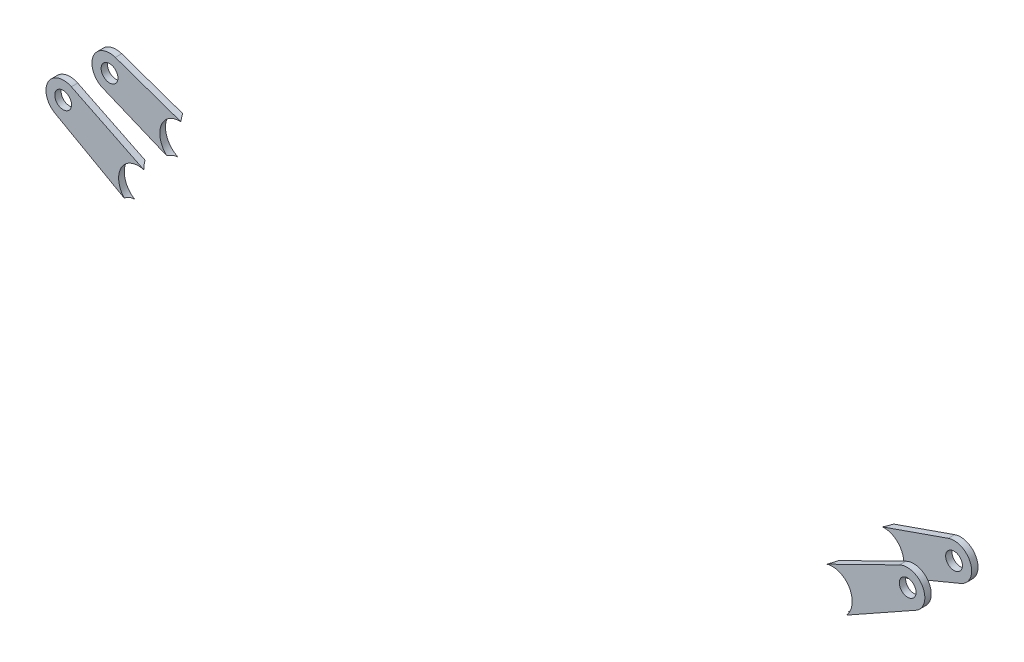
ISO-10303-21;
HEADER;
FILE_DESCRIPTION(('STEP AP214'),'2;1');
FILE_NAME('part.step','',(''),(''),'','','');
FILE_SCHEMA(('AUTOMOTIVE_DESIGN { 1 0 10303 214 1 1 1 1 }'));
ENDSEC;
DATA;
#1=APPLICATION_CONTEXT('core data for automotive mechanical design processes');
#2=APPLICATION_PROTOCOL_DEFINITION('international standard','automotive_design',2000,#1);
#3=PRODUCT_CONTEXT('',#1,'mechanical');
#4=PRODUCT('Part','Part','',(#3));
#5=PRODUCT_RELATED_PRODUCT_CATEGORY('part','',(#4));
#6=PRODUCT_DEFINITION_FORMATION('','',#4);
#7=PRODUCT_DEFINITION_CONTEXT('part definition',#1,'design');
#8=PRODUCT_DEFINITION('design','',#6,#7);
#9=PRODUCT_DEFINITION_SHAPE('','',#8);
#10=(LENGTH_UNIT() NAMED_UNIT(*) SI_UNIT(.MILLI.,.METRE.));
#11=(NAMED_UNIT(*) PLANE_ANGLE_UNIT() SI_UNIT($,.RADIAN.));
#12=(NAMED_UNIT(*) SI_UNIT($,.STERADIAN.) SOLID_ANGLE_UNIT());
#13=UNCERTAINTY_MEASURE_WITH_UNIT(LENGTH_MEASURE(1.E-05),#10,'distance_accuracy_value','');
#14=(GEOMETRIC_REPRESENTATION_CONTEXT(3) GLOBAL_UNCERTAINTY_ASSIGNED_CONTEXT((#13)) GLOBAL_UNIT_ASSIGNED_CONTEXT((#10,
#11,#12)) REPRESENTATION_CONTEXT('',''));
#15=CARTESIAN_POINT('',(0.,0.,0.));
#16=DIRECTION('',(0.,0.,1.));
#17=DIRECTION('',(1.,0.,0.));
#18=AXIS2_PLACEMENT_3D('',#15,#16,#17);
#19=CARTESIAN_POINT('',(-264.066756368698,346.748787271508,-554.000000000037));
#20=DIRECTION('',(0.,0.,1.));
#21=DIRECTION('',(-1.,0.,0.));
#22=AXIS2_PLACEMENT_3D('',#19,#20,#21);
#23=PLANE('',#22);
#24=CARTESIAN_POINT('',(-220.288002518882,330.720000000011,-554.000000000037));
#25=DIRECTION('',(0.,0.,-1.));
#26=DIRECTION('',(-0.371390712537474,0.928476676411911,0.));
#27=AXIS2_PLACEMENT_3D('',#24,#25,#26);
#28=ELLIPSE('',#27,13.264929634842,12.7);
#29=CARTESIAN_POINT('',(-222.319920017597,343.797739310754,-554.000000000037));
#30=VERTEX_POINT('',#29);
#31=CARTESIAN_POINT('',(-224.495297109862,318.402702599995,-554.000000000037));
#32=VERTEX_POINT('',#31);
#33=EDGE_CURVE('E133',#30,#32,#28,.F.);
#34=ORIENTED_EDGE('',*,*,#33,.T.);
#35=DIRECTION('',(0.383895306718322,0.923376626019765,0.));
#36=VECTOR('',#35,1.);
#37=CARTESIAN_POINT('',(-219.840002648539,329.600000450732,-554.000000000037));
#38=LINE('',#37,#36);
#39=CARTESIAN_POINT('',(-224.499302980811,318.393067349093,-554.000000000037));
#40=VERTEX_POINT('',#39);
#41=EDGE_CURVE('E131',#40,#32,#38,.T.);
#42=ORIENTED_EDGE('',*,*,#41,.F.);
#43=DIRECTION('',(0.923431267033575,-0.383763853254531,0.));
#44=VECTOR('',#43,1.);
#45=CARTESIAN_POINT('',(-268.288158754498,336.591043334139,-554.000000000037));
#46=LINE('',#45,#44);
#47=CARTESIAN_POINT('',(-268.288158754498,336.591043334139,-554.000000000037));
#48=VERTEX_POINT('',#47);
#49=EDGE_CURVE('E139',#48,#40,#46,.T.);
#50=ORIENTED_EDGE('',*,*,#49,.F.);
#51=CARTESIAN_POINT('',(-264.066756368698,346.748787271508,-554.000000000037));
#52=DIRECTION('',(0.,0.,1.));
#53=DIRECTION('',(-1.,0.,0.));
#54=AXIS2_PLACEMENT_3D('',#51,#52,#53);
#55=CIRCLE('',#54,11.);
#56=CARTESIAN_POINT('',(-260.434370912229,357.131743300291,-554.000000000037));
#57=VERTEX_POINT('',#56);
#58=EDGE_CURVE('E165',#57,#48,#55,.T.);
#59=ORIENTED_EDGE('',*,*,#58,.F.);
#60=DIRECTION('',(-0.943905093525682,0.33021685967902,0.));
#61=VECTOR('',#60,1.);
#62=CARTESIAN_POINT('',(-215.44583360379,341.392900896066,-554.000000000037));
#63=LINE('',#62,#61);
#64=EDGE_CURVE('E85',#30,#57,#63,.T.);
#65=ORIENTED_EDGE('',*,*,#64,.F.);
#66=EDGE_LOOP('',(#34,#42,#50,#59,#65));
#67=FACE_BOUND('',#66,.T.);
#68=CARTESIAN_POINT('',(-264.066756368698,346.748787271508,-554.000000000037));
#69=DIRECTION('',(0.,0.,1.));
#70=DIRECTION('',(1.,0.,0.));
#71=AXIS2_PLACEMENT_3D('',#68,#69,#70);
#72=CIRCLE('',#71,5.25);
#73=CARTESIAN_POINT('',(-258.816756368699,346.748787271508,-554.000000000037));
#74=VERTEX_POINT('',#73);
#75=EDGE_CURVE('E140',#74,#74,#72,.T.);
#76=ORIENTED_EDGE('',*,*,#75,.T.);
#77=EDGE_LOOP('',(#76));
#78=FACE_BOUND('',#77,.T.);
#79=ADVANCED_FACE('F82',(#67,#78),#23,.F.);
#80=CARTESIAN_POINT('',(-264.066756368698,346.748787271508,-550.000000000037));
#81=DIRECTION('',(0.,0.,1.));
#82=DIRECTION('',(-1.,0.,0.));
#83=AXIS2_PLACEMENT_3D('',#80,#81,#82);
#84=PLANE('',#83);
#85=DIRECTION('',(-0.943905093525682,0.33021685967902,0.));
#86=VECTOR('',#85,1.);
#87=CARTESIAN_POINT('',(-215.44583360379,341.392900896066,-550.000000000037));
#88=LINE('',#87,#86);
#89=CARTESIAN_POINT('',(-219.346050113219,342.757357192198,-550.000000000037));
#90=VERTEX_POINT('',#89);
#91=CARTESIAN_POINT('',(-260.434370912229,357.131743300291,-550.000000000037));
#92=VERTEX_POINT('',#91);
#93=EDGE_CURVE('E162',#90,#92,#88,.T.);
#94=ORIENTED_EDGE('',*,*,#93,.T.);
#95=CARTESIAN_POINT('',(-264.066756368698,346.748787271508,-550.000000000037));
#96=DIRECTION('',(0.,0.,1.));
#97=DIRECTION('',(-1.,0.,0.));
#98=AXIS2_PLACEMENT_3D('',#95,#96,#97);
#99=CIRCLE('',#98,11.);
#100=CARTESIAN_POINT('',(-268.288158754498,336.591043334139,-550.000000000037));
#101=VERTEX_POINT('',#100);
#102=EDGE_CURVE('E155',#92,#101,#99,.T.);
#103=ORIENTED_EDGE('',*,*,#102,.T.);
#104=DIRECTION('',(0.923431267033575,-0.383763853254531,0.));
#105=VECTOR('',#104,1.);
#106=CARTESIAN_POINT('',(-268.288158754498,336.591043334139,-550.000000000037));
#107=LINE('',#106,#105);
#108=CARTESIAN_POINT('',(-228.282606535205,319.965350205326,-550.000000000037));
#109=VERTEX_POINT('',#108);
#110=EDGE_CURVE('E141',#101,#109,#107,.T.);
#111=ORIENTED_EDGE('',*,*,#110,.T.);
#112=CARTESIAN_POINT('',(-219.840002468251,329.600000000011,-550.000000000037));
#113=DIRECTION('',(0.,0.,-1.));
#114=DIRECTION('',(-0.371390712537474,0.928476676411911,0.));
#115=AXIS2_PLACEMENT_3D('',#112,#113,#114);
#116=ELLIPSE('',#115,13.264929634842,12.7);
#117=EDGE_CURVE('E144',#90,#109,#116,.F.);
#118=ORIENTED_EDGE('',*,*,#117,.F.);
#119=EDGE_LOOP('',(#94,#103,#111,#118));
#120=FACE_BOUND('',#119,.T.);
#121=CARTESIAN_POINT('',(-264.066756368698,346.748787271508,-550.000000000037));
#122=DIRECTION('',(0.,0.,1.));
#123=DIRECTION('',(1.,0.,0.));
#124=AXIS2_PLACEMENT_3D('',#121,#122,#123);
#125=CIRCLE('',#124,5.25);
#126=CARTESIAN_POINT('',(-258.816756368699,346.748787271508,-550.000000000037));
#127=VERTEX_POINT('',#126);
#128=EDGE_CURVE('E149',#127,#127,#125,.T.);
#129=ORIENTED_EDGE('',*,*,#128,.F.);
#130=EDGE_LOOP('',(#129));
#131=FACE_BOUND('',#130,.T.);
#132=ADVANCED_FACE('F152',(#120,#131),#84,.T.);
#133=CARTESIAN_POINT('',(-215.44583360379,341.392900896066,-554.000000000037));
#134=DIRECTION('',(-0.33021685967902,-0.943905093525682,0.));
#135=DIRECTION('',(-0.943905093525682,0.33021685967902,0.));
#136=AXIS2_PLACEMENT_3D('',#133,#134,#135);
#137=PLANE('',#136);
#138=CARTESIAN_POINT('',(-226.039620658838,345.099043724854,-605.353727588761));
#139=DIRECTION('',(0.33021685967902,0.943905093525682,0.));
#140=DIRECTION('',(-0.183492724245197,0.0641933088292495,-0.980922850814797));
#141=AXIS2_PLACEMENT_3D('',#138,#139,#140);
#142=ELLIPSE('',#141,58.3563423851915,12.7);
#143=EDGE_CURVE('E100',#90,#30,#142,.F.);
#144=ORIENTED_EDGE('',*,*,#143,.T.);
#145=ORIENTED_EDGE('',*,*,#64,.T.);
#146=DIRECTION('',(0.,0.,1.));
#147=VECTOR('',#146,1.);
#148=CARTESIAN_POINT('',(-260.434370912229,357.131743300291,-554.000000000037));
#149=LINE('',#148,#147);
#150=EDGE_CURVE('E158',#57,#92,#149,.T.);
#151=ORIENTED_EDGE('',*,*,#150,.T.);
#152=ORIENTED_EDGE('',*,*,#93,.F.);
#153=EDGE_LOOP('',(#144,#145,#151,#152));
#154=FACE_BOUND('',#153,.T.);
#155=ADVANCED_FACE('F179',(#154),#137,.F.);
#156=CARTESIAN_POINT('',(-264.066756368698,346.748787271508,-554.000000000037));
#157=DIRECTION('',(0.,0.,1.));
#158=DIRECTION('',(-1.,0.,0.));
#159=AXIS2_PLACEMENT_3D('',#156,#157,#158);
#160=CYLINDRICAL_SURFACE('',#159,11.);
#161=ORIENTED_EDGE('',*,*,#102,.F.);
#162=ORIENTED_EDGE('',*,*,#150,.F.);
#163=ORIENTED_EDGE('',*,*,#58,.T.);
#164=DIRECTION('',(0.,0.,1.));
#165=VECTOR('',#164,1.);
#166=CARTESIAN_POINT('',(-268.288158754498,336.591043334139,-554.000000000037));
#167=LINE('',#166,#165);
#168=EDGE_CURVE('E156',#48,#101,#167,.T.);
#169=ORIENTED_EDGE('',*,*,#168,.T.);
#170=EDGE_LOOP('',(#161,#162,#163,#169));
#171=FACE_BOUND('',#170,.T.);
#172=ADVANCED_FACE('F182',(#171),#160,.T.);
#173=CARTESIAN_POINT('',(-268.288158754498,336.591043334139,-554.000000000037));
#174=DIRECTION('',(0.383763853254531,0.923431267033575,0.));
#175=DIRECTION('',(0.923431267033575,-0.383763853254531,0.));
#176=AXIS2_PLACEMENT_3D('',#173,#174,#175);
#177=PLANE('',#176);
#178=CARTESIAN_POINT('',(-213.534508639396,313.836267209412,-493.700954319327));
#179=DIRECTION('',(-0.383763853254531,-0.923431267033575,0.));
#180=DIRECTION('',(-0.190540956691631,0.0791858954242286,-0.978480320593573));
#181=AXIS2_PLACEMENT_3D('',#178,#179,#180);
#182=ELLIPSE('',#181,61.531584385381,12.7);
#183=CARTESIAN_POINT('',(-224.499302980811,318.393067349093,-553.952574537632));
#184=VERTEX_POINT('',#183);
#185=EDGE_CURVE('E13',#184,#109,#182,.F.);
#186=ORIENTED_EDGE('',*,*,#185,.T.);
#187=ORIENTED_EDGE('',*,*,#110,.F.);
#188=ORIENTED_EDGE('',*,*,#168,.F.);
#189=ORIENTED_EDGE('',*,*,#49,.T.);
#190=DIRECTION('',(0.,0.,1.));
#191=VECTOR('',#190,1.);
#192=CARTESIAN_POINT('',(-224.499302980811,318.393067349093,-554.000000000037));
#193=LINE('',#192,#191);
#194=EDGE_CURVE('E128',#40,#184,#193,.T.);
#195=ORIENTED_EDGE('',*,*,#194,.T.);
#196=EDGE_LOOP('',(#186,#187,#188,#189,#195));
#197=FACE_BOUND('',#196,.T.);
#198=ADVANCED_FACE('F136',(#197),#177,.F.);
#199=CARTESIAN_POINT('',(-219.840002648539,329.600000450732,-554.000000000037));
#200=DIRECTION('',(-0.923376626019765,0.383895306718322,0.));
#201=DIRECTION('',(0.383895306718322,0.923376626019765,0.));
#202=AXIS2_PLACEMENT_3D('',#199,#200,#201);
#203=PLANE('',#202);
#204=CARTESIAN_POINT('',(-219.840002648539,329.600000450732,-550.000001609755));
#205=DIRECTION('',(0.923376626019765,-0.383895306718322,0.));
#206=DIRECTION('',(0.0808905062201568,0.194564511218158,-0.977548657089705));
#207=AXIS2_PLACEMENT_3D('',#204,#205,#206);
#208=ELLIPSE('',#207,62.8941259124316,12.7);
#209=EDGE_CURVE('E91',#32,#184,#208,.F.);
#210=ORIENTED_EDGE('',*,*,#209,.T.);
#211=ORIENTED_EDGE('',*,*,#194,.F.);
#212=ORIENTED_EDGE('',*,*,#41,.T.);
#213=EDGE_LOOP('',(#210,#211,#212));
#214=FACE_BOUND('',#213,.T.);
#215=ADVANCED_FACE('F127',(#214),#203,.F.);
#216=CARTESIAN_POINT('',(-264.066756368698,346.748787271508,-554.000000000037));
#217=DIRECTION('',(0.,0.,1.));
#218=DIRECTION('',(-1.,0.,0.));
#219=AXIS2_PLACEMENT_3D('',#216,#217,#218);
#220=CYLINDRICAL_SURFACE('',#219,5.25);
#221=ORIENTED_EDGE('',*,*,#75,.F.);
#222=EDGE_LOOP('',(#221));
#223=FACE_BOUND('',#222,.T.);
#224=ORIENTED_EDGE('',*,*,#128,.T.);
#225=EDGE_LOOP('',(#224));
#226=FACE_BOUND('',#225,.T.);
#227=ADVANCED_FACE('F199',(#223,#226),#220,.F.);
#228=CARTESIAN_POINT('',(-198.,275.,-355.));
#229=DIRECTION('',(-0.107230132379773,0.268075300652914,-0.957411788046119));
#230=DIRECTION('',(0.,-0.962964019714182,-0.269629925519972));
#231=AXIS2_PLACEMENT_3D('',#228,#229,#230);
#232=CYLINDRICAL_SURFACE('',#231,12.7);
#233=ORIENTED_EDGE('',*,*,#143,.F.);
#234=ORIENTED_EDGE('',*,*,#117,.T.);
#235=ORIENTED_EDGE('',*,*,#185,.F.);
#236=ORIENTED_EDGE('',*,*,#209,.F.);
#237=ORIENTED_EDGE('',*,*,#33,.F.);
#238=EDGE_LOOP('',(#233,#234,#235,#236,#237));
#239=FACE_BOUND('',#238,.T.);
#240=ADVANCED_FACE('F143',(#239),#232,.F.);
#241=CLOSED_SHELL('',(#79,#132,#155,#172,#198,#215,#227,#240));
#242=MANIFOLD_SOLID_BREP('B2',#241);
#243=CARTESIAN_POINT('',(-258.952329399066,356.482912678988,-525.000000000035));
#244=DIRECTION('',(0.440880106667431,0.897566004004672,0.));
#245=DIRECTION('',(0.897566004004672,-0.440880106667431,0.));
#246=AXIS2_PLACEMENT_3D('',#243,#244,#245);
#247=PLANE('',#246);
#248=DIRECTION('',(0.897566004004672,-0.440880106667431,0.));
#249=VECTOR('',#248,1.);
#250=CARTESIAN_POINT('',(-258.952329399066,356.482912678988,-525.000000000035));
#251=LINE('',#250,#249);
#252=CARTESIAN_POINT('',(-258.952329399066,356.482912678988,-525.000000000035));
#253=VERTEX_POINT('',#252);
#254=CARTESIAN_POINT('',(-216.788322076619,335.772154959882,-525.000000000035));
#255=VERTEX_POINT('',#254);
#256=EDGE_CURVE('E318',#253,#255,#251,.T.);
#257=ORIENTED_EDGE('',*,*,#256,.F.);
#258=DIRECTION('',(0.,0.,1.));
#259=VECTOR('',#258,1.);
#260=CARTESIAN_POINT('',(-258.952329399066,356.482912678988,-525.000000000035));
#261=LINE('',#260,#259);
#262=CARTESIAN_POINT('',(-258.952329399066,356.482912678988,-521.000000000035));
#263=VERTEX_POINT('',#262);
#264=EDGE_CURVE('E317',#253,#263,#261,.T.);
#265=ORIENTED_EDGE('',*,*,#264,.T.);
#266=DIRECTION('',(0.897566004004672,-0.440880106667431,0.));
#267=VECTOR('',#266,1.);
#268=CARTESIAN_POINT('',(-258.952329399066,356.482912678988,-521.000000000035));
#269=LINE('',#268,#267);
#270=CARTESIAN_POINT('',(-213.587596057391,334.19997372477,-521.000000000035));
#271=VERTEX_POINT('',#270);
#272=EDGE_CURVE('E308',#263,#271,#269,.T.);
#273=ORIENTED_EDGE('',*,*,#272,.T.);
#274=CARTESIAN_POINT('',(-223.658754171646,339.146878179559,-584.095993498423));
#275=DIRECTION('',(-0.440880106667431,-0.897566004004672,0.));
#276=DIRECTION('',(-0.196171113841194,0.0963583081461315,-0.975823739486553));
#277=AXIS2_PLACEMENT_3D('',#274,#275,#276);
#278=ELLIPSE('',#277,65.6875109810319,12.7);
#279=EDGE_CURVE('E313',#255,#271,#278,.F.);
#280=ORIENTED_EDGE('',*,*,#279,.F.);
#281=EDGE_LOOP('',(#257,#265,#273,#280));
#282=FACE_BOUND('',#281,.T.);
#283=ADVANCED_FACE('F265',(#282),#247,.T.);
#284=CARTESIAN_POINT('',(-263.802010572408,346.609686634937,-525.000000000035));
#285=DIRECTION('',(0.,0.,1.));
#286=DIRECTION('',(-1.,0.,0.));
#287=AXIS2_PLACEMENT_3D('',#284,#285,#286);
#288=CYLINDRICAL_SURFACE('',#287,11.);
#289=ORIENTED_EDGE('',*,*,#264,.F.);
#290=CARTESIAN_POINT('',(-263.802010572408,346.609686634937,-525.000000000035));
#291=DIRECTION('',(0.,0.,1.));
#292=DIRECTION('',(1.,0.,0.));
#293=AXIS2_PLACEMENT_3D('',#290,#291,#292);
#294=CIRCLE('',#293,11.);
#295=CARTESIAN_POINT('',(-269.181183338331,337.014661864028,-525.000000000035));
#296=VERTEX_POINT('',#295);
#297=EDGE_CURVE('E323',#253,#296,#294,.T.);
#298=ORIENTED_EDGE('',*,*,#297,.T.);
#299=DIRECTION('',(0.,0.,1.));
#300=VECTOR('',#299,1.);
#301=CARTESIAN_POINT('',(-269.181183338331,337.014661864028,-525.000000000035));
#302=LINE('',#301,#300);
#303=CARTESIAN_POINT('',(-269.181183338331,337.014661864028,-521.000000000035));
#304=VERTEX_POINT('',#303);
#305=EDGE_CURVE('E340',#296,#304,#302,.T.);
#306=ORIENTED_EDGE('',*,*,#305,.T.);
#307=CARTESIAN_POINT('',(-263.802010572408,346.609686634937,-521.000000000035));
#308=DIRECTION('',(0.,0.,1.));
#309=DIRECTION('',(1.,0.,0.));
#310=AXIS2_PLACEMENT_3D('',#307,#308,#309);
#311=CIRCLE('',#310,11.);
#312=EDGE_CURVE('E339',#263,#304,#311,.T.);
#313=ORIENTED_EDGE('',*,*,#312,.F.);
#314=EDGE_LOOP('',(#289,#298,#306,#313));
#315=FACE_BOUND('',#314,.T.);
#316=ADVANCED_FACE('F344',(#315),#288,.T.);
#317=CARTESIAN_POINT('',(-269.181183338331,337.014661864028,-525.000000000035));
#318=DIRECTION('',(0.489015705992998,0.872274979173523,0.));
#319=DIRECTION('',(0.872274979173523,-0.489015705992998,0.));
#320=AXIS2_PLACEMENT_3D('',#317,#318,#319);
#321=PLANE('',#320);
#322=CARTESIAN_POINT('',(-209.400039140989,303.500094631535,-456.786052255481));
#323=DIRECTION('',(-0.489015705992998,-0.872274979173523,0.));
#324=DIRECTION('',(-0.199242161002936,0.111699347513944,-0.973563463285183));
#325=AXIS2_PLACEMENT_3D('',#322,#323,#324);
#326=ELLIPSE('',#325,70.0117361262154,12.7);
#327=CARTESIAN_POINT('',(-223.057162382776,311.156565266797,-525.000000000035));
#328=VERTEX_POINT('',#327);
#329=CARTESIAN_POINT('',(-225.925664786417,312.764708067578,-521.000000000035));
#330=VERTEX_POINT('',#329);
#331=EDGE_CURVE('E269',#328,#330,#326,.F.);
#332=ORIENTED_EDGE('',*,*,#331,.T.);
#333=DIRECTION('',(0.872274979173523,-0.489015705992998,0.));
#334=VECTOR('',#333,1.);
#335=CARTESIAN_POINT('',(-269.181183338331,337.014661864028,-521.000000000035));
#336=LINE('',#335,#334);
#337=EDGE_CURVE('E310',#304,#330,#336,.T.);
#338=ORIENTED_EDGE('',*,*,#337,.F.);
#339=ORIENTED_EDGE('',*,*,#305,.F.);
#340=DIRECTION('',(0.872274979173523,-0.489015705992998,0.));
#341=VECTOR('',#340,1.);
#342=CARTESIAN_POINT('',(-269.181183338331,337.014661864028,-525.000000000035));
#343=LINE('',#342,#341);
#344=EDGE_CURVE('E328',#296,#328,#343,.T.);
#345=ORIENTED_EDGE('',*,*,#344,.T.);
#346=EDGE_LOOP('',(#332,#338,#339,#345));
#347=FACE_BOUND('',#346,.T.);
#348=ADVANCED_FACE('F345',(#347),#321,.F.);
#349=CARTESIAN_POINT('',(-263.802010572408,346.609686634937,-525.000000000035));
#350=DIRECTION('',(0.,0.,-1.));
#351=DIRECTION('',(1.,0.,0.));
#352=AXIS2_PLACEMENT_3D('',#349,#350,#351);
#353=PLANE('',#352);
#354=CARTESIAN_POINT('',(-264.066756368699,346.748787271508,-525.000000000035));
#355=DIRECTION('',(0.,0.,-1.));
#356=DIRECTION('',(-1.,0.,0.));
#357=AXIS2_PLACEMENT_3D('',#354,#355,#356);
#358=CIRCLE('',#357,5.25);
#359=CARTESIAN_POINT('',(-269.316756368699,346.748787271508,-525.000000000035));
#360=VERTEX_POINT('',#359);
#361=EDGE_CURVE('E331',#360,#360,#358,.T.);
#362=ORIENTED_EDGE('',*,*,#361,.F.);
#363=EDGE_LOOP('',(#362));
#364=FACE_BOUND('',#363,.T.);
#365=ORIENTED_EDGE('',*,*,#344,.F.);
#366=ORIENTED_EDGE('',*,*,#297,.F.);
#367=ORIENTED_EDGE('',*,*,#256,.T.);
#368=CARTESIAN_POINT('',(-217.040002151809,322.60000000001,-525.000000000035));
#369=DIRECTION('',(0.,0.,1.));
#370=DIRECTION('',(-0.371390712537467,0.928476676411913,0.));
#371=AXIS2_PLACEMENT_3D('',#368,#369,#370);
#372=ELLIPSE('',#371,13.264929634842,12.7);
#373=EDGE_CURVE('E282',#328,#255,#372,.F.);
#374=ORIENTED_EDGE('',*,*,#373,.F.);
#375=EDGE_LOOP('',(#365,#366,#367,#374));
#376=FACE_BOUND('',#375,.T.);
#377=ADVANCED_FACE('F347',(#364,#376),#353,.T.);
#378=CARTESIAN_POINT('',(-264.066756368699,346.748787271508,-525.000000000035));
#379=DIRECTION('',(0.,0.,1.));
#380=DIRECTION('',(-1.,0.,0.));
#381=AXIS2_PLACEMENT_3D('',#378,#379,#380);
#382=CYLINDRICAL_SURFACE('',#381,5.25);
#383=ORIENTED_EDGE('',*,*,#361,.T.);
#384=EDGE_LOOP('',(#383));
#385=FACE_BOUND('',#384,.T.);
#386=CARTESIAN_POINT('',(-264.066756368699,346.748787271508,-521.000000000035));
#387=DIRECTION('',(0.,0.,-1.));
#388=DIRECTION('',(-1.,0.,0.));
#389=AXIS2_PLACEMENT_3D('',#386,#387,#388);
#390=CIRCLE('',#389,5.25);
#391=CARTESIAN_POINT('',(-269.316756368699,346.748787271508,-521.000000000035));
#392=VERTEX_POINT('',#391);
#393=EDGE_CURVE('E320',#392,#392,#390,.T.);
#394=ORIENTED_EDGE('',*,*,#393,.F.);
#395=EDGE_LOOP('',(#394));
#396=FACE_BOUND('',#395,.T.);
#397=ADVANCED_FACE('F353',(#385,#396),#382,.F.);
#398=CARTESIAN_POINT('',(-263.802010572408,346.609686634937,-521.000000000035));
#399=DIRECTION('',(0.,0.,-1.));
#400=DIRECTION('',(1.,0.,0.));
#401=AXIS2_PLACEMENT_3D('',#398,#399,#400);
#402=PLANE('',#401);
#403=CARTESIAN_POINT('',(-216.592002101178,321.48000000001,-521.000000000035));
#404=DIRECTION('',(0.,0.,1.));
#405=DIRECTION('',(-0.371390712537467,0.928476676411913,0.));
#406=AXIS2_PLACEMENT_3D('',#403,#404,#405);
#407=ELLIPSE('',#406,13.264929634842,12.7);
#408=EDGE_CURVE('E80',#330,#271,#407,.F.);
#409=ORIENTED_EDGE('',*,*,#408,.T.);
#410=ORIENTED_EDGE('',*,*,#272,.F.);
#411=ORIENTED_EDGE('',*,*,#312,.T.);
#412=ORIENTED_EDGE('',*,*,#337,.T.);
#413=EDGE_LOOP('',(#409,#410,#411,#412));
#414=FACE_BOUND('',#413,.T.);
#415=ORIENTED_EDGE('',*,*,#393,.T.);
#416=EDGE_LOOP('',(#415));
#417=FACE_BOUND('',#416,.T.);
#418=ADVANCED_FACE('F267',(#414,#417),#402,.F.);
#419=CARTESIAN_POINT('',(-198.,275.,-355.));
#420=DIRECTION('',(-0.107230132379773,0.268075300652914,-0.957411788046119));
#421=DIRECTION('',(0.,-0.962964019714182,-0.269629925519972));
#422=AXIS2_PLACEMENT_3D('',#419,#420,#421);
#423=CYLINDRICAL_SURFACE('',#422,12.7);
#424=ORIENTED_EDGE('',*,*,#331,.F.);
#425=ORIENTED_EDGE('',*,*,#373,.T.);
#426=ORIENTED_EDGE('',*,*,#279,.T.);
#427=ORIENTED_EDGE('',*,*,#408,.F.);
#428=EDGE_LOOP('',(#424,#425,#426,#427));
#429=FACE_BOUND('',#428,.T.);
#430=ADVANCED_FACE('F314',(#429),#423,.F.);
#431=CLOSED_SHELL('',(#283,#316,#348,#377,#397,#418,#430));
#432=MANIFOLD_SOLID_BREP('B7',#431);
#433=CARTESIAN_POINT('',(264.066756368698,346.748787271508,-554.000000000037));
#434=DIRECTION('',(0.,0.,1.));
#435=DIRECTION('',(1.,0.,0.));
#436=AXIS2_PLACEMENT_3D('',#433,#434,#435);
#437=PLANE('',#436);
#438=CARTESIAN_POINT('',(220.288002518882,330.720000000011,-554.000000000037));
#439=DIRECTION('',(0.,0.,1.));
#440=DIRECTION('',(0.371390712537474,0.928476676411911,0.));
#441=AXIS2_PLACEMENT_3D('',#438,#439,#440);
#442=ELLIPSE('',#441,13.264929634842,12.7);
#443=CARTESIAN_POINT('',(222.319920017597,343.797739310754,-554.000000000037));
#444=VERTEX_POINT('',#443);
#445=CARTESIAN_POINT('',(224.495297109862,318.402702599995,-554.000000000037));
#446=VERTEX_POINT('',#445);
#447=EDGE_CURVE('E462',#444,#446,#442,.F.);
#448=ORIENTED_EDGE('',*,*,#447,.F.);
#449=DIRECTION('',(0.943905093525682,0.33021685967902,0.));
#450=VECTOR('',#449,1.);
#451=CARTESIAN_POINT('',(215.44583360379,341.392900896066,-554.000000000037));
#452=LINE('',#451,#450);
#453=CARTESIAN_POINT('',(260.434370912229,357.131743300291,-554.000000000037));
#454=VERTEX_POINT('',#453);
#455=EDGE_CURVE('E424',#444,#454,#452,.T.);
#456=ORIENTED_EDGE('',*,*,#455,.T.);
#457=CARTESIAN_POINT('',(264.066756368698,346.748787271508,-554.000000000037));
#458=DIRECTION('',(0.,0.,-1.));
#459=DIRECTION('',(1.,0.,0.));
#460=AXIS2_PLACEMENT_3D('',#457,#458,#459);
#461=CIRCLE('',#460,11.);
#462=CARTESIAN_POINT('',(268.288158754498,336.591043334139,-554.000000000037));
#463=VERTEX_POINT('',#462);
#464=EDGE_CURVE('E500',#454,#463,#461,.T.);
#465=ORIENTED_EDGE('',*,*,#464,.T.);
#466=DIRECTION('',(-0.923431267033575,-0.383763853254531,0.));
#467=VECTOR('',#466,1.);
#468=CARTESIAN_POINT('',(268.288158754498,336.591043334139,-554.000000000037));
#469=LINE('',#468,#467);
#470=CARTESIAN_POINT('',(224.499302980811,318.393067349093,-554.000000000037));
#471=VERTEX_POINT('',#470);
#472=EDGE_CURVE('E498',#463,#471,#469,.T.);
#473=ORIENTED_EDGE('',*,*,#472,.T.);
#474=DIRECTION('',(-0.383895306718322,0.923376626019765,0.));
#475=VECTOR('',#474,1.);
#476=CARTESIAN_POINT('',(219.840002648539,329.600000450732,-554.000000000037));
#477=LINE('',#476,#475);
#478=EDGE_CURVE('E481',#471,#446,#477,.T.);
#479=ORIENTED_EDGE('',*,*,#478,.T.);
#480=EDGE_LOOP('',(#448,#456,#465,#473,#479));
#481=FACE_BOUND('',#480,.T.);
#482=CARTESIAN_POINT('',(264.066756368698,346.748787271508,-554.000000000037));
#483=DIRECTION('',(0.,0.,-1.));
#484=DIRECTION('',(-1.,0.,0.));
#485=AXIS2_PLACEMENT_3D('',#482,#483,#484);
#486=CIRCLE('',#485,5.25);
#487=CARTESIAN_POINT('',(258.816756368699,346.748787271508,-554.000000000037));
#488=VERTEX_POINT('',#487);
#489=EDGE_CURVE('E482',#488,#488,#486,.T.);
#490=ORIENTED_EDGE('',*,*,#489,.F.);
#491=EDGE_LOOP('',(#490));
#492=FACE_BOUND('',#491,.T.);
#493=ADVANCED_FACE('F421',(#481,#492),#437,.F.);
#494=CARTESIAN_POINT('',(264.066756368698,346.748787271508,-550.000000000037));
#495=DIRECTION('',(0.,0.,1.));
#496=DIRECTION('',(1.,0.,0.));
#497=AXIS2_PLACEMENT_3D('',#494,#495,#496);
#498=PLANE('',#497);
#499=DIRECTION('',(0.943905093525682,0.33021685967902,0.));
#500=VECTOR('',#499,1.);
#501=CARTESIAN_POINT('',(215.44583360379,341.392900896066,-550.000000000037));
#502=LINE('',#501,#500);
#503=CARTESIAN_POINT('',(219.346050113219,342.757357192198,-550.000000000037));
#504=VERTEX_POINT('',#503);
#505=CARTESIAN_POINT('',(260.434370912229,357.131743300291,-550.000000000037));
#506=VERTEX_POINT('',#505);
#507=EDGE_CURVE('E495',#504,#506,#502,.T.);
#508=ORIENTED_EDGE('',*,*,#507,.F.);
#509=CARTESIAN_POINT('',(219.840002468251,329.600000000011,-550.000000000037));
#510=DIRECTION('',(0.,0.,1.));
#511=DIRECTION('',(0.371390712537474,0.928476676411911,0.));
#512=AXIS2_PLACEMENT_3D('',#509,#510,#511);
#513=ELLIPSE('',#512,13.264929634842,12.7);
#514=CARTESIAN_POINT('',(228.282606535205,319.965350205326,-550.000000000037));
#515=VERTEX_POINT('',#514);
#516=EDGE_CURVE('E438',#504,#515,#513,.F.);
#517=ORIENTED_EDGE('',*,*,#516,.T.);
#518=DIRECTION('',(-0.923431267033575,-0.383763853254531,0.));
#519=VECTOR('',#518,1.);
#520=CARTESIAN_POINT('',(268.288158754498,336.591043334139,-550.000000000037));
#521=LINE('',#520,#519);
#522=CARTESIAN_POINT('',(268.288158754498,336.591043334139,-550.000000000037));
#523=VERTEX_POINT('',#522);
#524=EDGE_CURVE('E479',#523,#515,#521,.T.);
#525=ORIENTED_EDGE('',*,*,#524,.F.);
#526=CARTESIAN_POINT('',(264.066756368698,346.748787271508,-550.000000000037));
#527=DIRECTION('',(0.,0.,-1.));
#528=DIRECTION('',(1.,0.,0.));
#529=AXIS2_PLACEMENT_3D('',#526,#527,#528);
#530=CIRCLE('',#529,11.);
#531=EDGE_CURVE('E492',#506,#523,#530,.T.);
#532=ORIENTED_EDGE('',*,*,#531,.F.);
#533=EDGE_LOOP('',(#508,#517,#525,#532));
#534=FACE_BOUND('',#533,.T.);
#535=CARTESIAN_POINT('',(264.066756368698,346.748787271508,-550.000000000037));
#536=DIRECTION('',(0.,0.,-1.));
#537=DIRECTION('',(-1.,0.,0.));
#538=AXIS2_PLACEMENT_3D('',#535,#536,#537);
#539=CIRCLE('',#538,5.25);
#540=CARTESIAN_POINT('',(258.816756368699,346.748787271508,-550.000000000037));
#541=VERTEX_POINT('',#540);
#542=EDGE_CURVE('E497',#541,#541,#539,.T.);
#543=ORIENTED_EDGE('',*,*,#542,.T.);
#544=EDGE_LOOP('',(#543));
#545=FACE_BOUND('',#544,.T.);
#546=ADVANCED_FACE('F515',(#534,#545),#498,.T.);
#547=CARTESIAN_POINT('',(215.44583360379,341.392900896066,-554.000000000037));
#548=DIRECTION('',(0.33021685967902,-0.943905093525682,0.));
#549=DIRECTION('',(0.943905093525682,0.33021685967902,0.));
#550=AXIS2_PLACEMENT_3D('',#547,#548,#549);
#551=PLANE('',#550);
#552=CARTESIAN_POINT('',(226.039620658838,345.099043724854,-605.353727588761));
#553=DIRECTION('',(0.33021685967902,-0.943905093525682,0.));
#554=DIRECTION('',(0.183492724245197,0.0641933088292495,-0.980922850814797));
#555=AXIS2_PLACEMENT_3D('',#552,#553,#554);
#556=ELLIPSE('',#555,58.3563423851915,12.7);
#557=EDGE_CURVE('E485',#504,#444,#556,.F.);
#558=ORIENTED_EDGE('',*,*,#557,.F.);
#559=ORIENTED_EDGE('',*,*,#507,.T.);
#560=DIRECTION('',(0.,0.,1.));
#561=VECTOR('',#560,1.);
#562=CARTESIAN_POINT('',(260.434370912229,357.131743300291,-554.000000000037));
#563=LINE('',#562,#561);
#564=EDGE_CURVE('E494',#454,#506,#563,.T.);
#565=ORIENTED_EDGE('',*,*,#564,.F.);
#566=ORIENTED_EDGE('',*,*,#455,.F.);
#567=EDGE_LOOP('',(#558,#559,#565,#566));
#568=FACE_BOUND('',#567,.T.);
#569=ADVANCED_FACE('F520',(#568),#551,.F.);
#570=CARTESIAN_POINT('',(264.066756368698,346.748787271508,-554.000000000037));
#571=DIRECTION('',(0.,0.,1.));
#572=DIRECTION('',(1.,0.,0.));
#573=AXIS2_PLACEMENT_3D('',#570,#571,#572);
#574=CYLINDRICAL_SURFACE('',#573,11.);
#575=ORIENTED_EDGE('',*,*,#531,.T.);
#576=DIRECTION('',(0.,0.,1.));
#577=VECTOR('',#576,1.);
#578=CARTESIAN_POINT('',(268.288158754498,336.591043334139,-554.000000000037));
#579=LINE('',#578,#577);
#580=EDGE_CURVE('E487',#463,#523,#579,.T.);
#581=ORIENTED_EDGE('',*,*,#580,.F.);
#582=ORIENTED_EDGE('',*,*,#464,.F.);
#583=ORIENTED_EDGE('',*,*,#564,.T.);
#584=EDGE_LOOP('',(#575,#581,#582,#583));
#585=FACE_BOUND('',#584,.T.);
#586=ADVANCED_FACE('F521',(#585),#574,.T.);
#587=CARTESIAN_POINT('',(268.288158754498,336.591043334139,-554.000000000037));
#588=DIRECTION('',(-0.383763853254531,0.923431267033575,0.));
#589=DIRECTION('',(-0.923431267033575,-0.383763853254531,0.));
#590=AXIS2_PLACEMENT_3D('',#587,#588,#589);
#591=PLANE('',#590);
#592=CARTESIAN_POINT('',(213.534508639396,313.836267209412,-493.700954319327));
#593=DIRECTION('',(-0.383763853254531,0.923431267033575,0.));
#594=DIRECTION('',(0.190540956691631,0.0791858954242286,-0.978480320593573));
#595=AXIS2_PLACEMENT_3D('',#592,#593,#594);
#596=ELLIPSE('',#595,61.531584385381,12.7);
#597=CARTESIAN_POINT('',(224.499302980811,318.393067349093,-553.952574537632));
#598=VERTEX_POINT('',#597);
#599=EDGE_CURVE('E263',#598,#515,#596,.F.);
#600=ORIENTED_EDGE('',*,*,#599,.F.);
#601=DIRECTION('',(0.,0.,1.));
#602=VECTOR('',#601,1.);
#603=CARTESIAN_POINT('',(224.499302980811,318.393067349093,-554.000000000037));
#604=LINE('',#603,#602);
#605=EDGE_CURVE('E476',#471,#598,#604,.T.);
#606=ORIENTED_EDGE('',*,*,#605,.F.);
#607=ORIENTED_EDGE('',*,*,#472,.F.);
#608=ORIENTED_EDGE('',*,*,#580,.T.);
#609=ORIENTED_EDGE('',*,*,#524,.T.);
#610=EDGE_LOOP('',(#600,#606,#607,#608,#609));
#611=FACE_BOUND('',#610,.T.);
#612=ADVANCED_FACE('F474',(#611),#591,.F.);
#613=CARTESIAN_POINT('',(219.840002648539,329.600000450732,-554.000000000037));
#614=DIRECTION('',(0.923376626019765,0.383895306718322,0.));
#615=DIRECTION('',(-0.383895306718322,0.923376626019765,0.));
#616=AXIS2_PLACEMENT_3D('',#613,#614,#615);
#617=PLANE('',#616);
#618=CARTESIAN_POINT('',(219.840002648539,329.600000450732,-550.000001609755));
#619=DIRECTION('',(0.923376626019765,0.383895306718322,0.));
#620=DIRECTION('',(-0.0808905062201568,0.194564511218158,-0.977548657089705));
#621=AXIS2_PLACEMENT_3D('',#618,#619,#620);
#622=ELLIPSE('',#621,62.8941259124316,12.7);
#623=EDGE_CURVE('E430',#446,#598,#622,.F.);
#624=ORIENTED_EDGE('',*,*,#623,.F.);
#625=ORIENTED_EDGE('',*,*,#478,.F.);
#626=ORIENTED_EDGE('',*,*,#605,.T.);
#627=EDGE_LOOP('',(#624,#625,#626));
#628=FACE_BOUND('',#627,.T.);
#629=ADVANCED_FACE('F480',(#628),#617,.F.);
#630=CARTESIAN_POINT('',(264.066756368698,346.748787271508,-554.000000000037));
#631=DIRECTION('',(0.,0.,1.));
#632=DIRECTION('',(1.,0.,0.));
#633=AXIS2_PLACEMENT_3D('',#630,#631,#632);
#634=CYLINDRICAL_SURFACE('',#633,5.25);
#635=ORIENTED_EDGE('',*,*,#489,.T.);
#636=EDGE_LOOP('',(#635));
#637=FACE_BOUND('',#636,.T.);
#638=ORIENTED_EDGE('',*,*,#542,.F.);
#639=EDGE_LOOP('',(#638));
#640=FACE_BOUND('',#639,.T.);
#641=ADVANCED_FACE('F538',(#637,#640),#634,.F.);
#642=CARTESIAN_POINT('',(198.,275.,-355.));
#643=DIRECTION('',(0.107230132379773,0.268075300652914,-0.957411788046119));
#644=DIRECTION('',(0.,-0.962964019714182,-0.269629925519972));
#645=AXIS2_PLACEMENT_3D('',#642,#643,#644);
#646=CYLINDRICAL_SURFACE('',#645,12.7);
#647=ORIENTED_EDGE('',*,*,#557,.T.);
#648=ORIENTED_EDGE('',*,*,#447,.T.);
#649=ORIENTED_EDGE('',*,*,#623,.T.);
#650=ORIENTED_EDGE('',*,*,#599,.T.);
#651=ORIENTED_EDGE('',*,*,#516,.F.);
#652=EDGE_LOOP('',(#647,#648,#649,#650,#651));
#653=FACE_BOUND('',#652,.T.);
#654=ADVANCED_FACE('F465',(#653),#646,.F.);
#655=CLOSED_SHELL('',(#493,#546,#569,#586,#612,#629,#641,#654));
#656=MANIFOLD_SOLID_BREP('B74',#655);
#657=CARTESIAN_POINT('',(258.952329399066,356.482912678988,-525.000000000035));
#658=DIRECTION('',(-0.440880106667431,0.897566004004672,0.));
#659=DIRECTION('',(-0.897566004004672,-0.440880106667431,0.));
#660=AXIS2_PLACEMENT_3D('',#657,#658,#659);
#661=PLANE('',#660);
#662=DIRECTION('',(-0.897566004004672,-0.440880106667431,0.));
#663=VECTOR('',#662,1.);
#664=CARTESIAN_POINT('',(258.952329399066,356.482912678988,-525.000000000035));
#665=LINE('',#664,#663);
#666=CARTESIAN_POINT('',(258.952329399066,356.482912678988,-525.000000000035));
#667=VERTEX_POINT('',#666);
#668=CARTESIAN_POINT('',(216.788322076619,335.772154959882,-525.000000000035));
#669=VERTEX_POINT('',#668);
#670=EDGE_CURVE('E642',#667,#669,#665,.T.);
#671=ORIENTED_EDGE('',*,*,#670,.T.);
#672=CARTESIAN_POINT('',(223.658754171646,339.146878179559,-584.095993498423));
#673=DIRECTION('',(-0.440880106667431,0.897566004004672,0.));
#674=DIRECTION('',(0.196171113841194,0.0963583081461315,-0.975823739486553));
#675=AXIS2_PLACEMENT_3D('',#672,#673,#674);
#676=ELLIPSE('',#675,65.6875109810319,12.7);
#677=CARTESIAN_POINT('',(213.587596057391,334.19997372477,-521.000000000035));
#678=VERTEX_POINT('',#677);
#679=EDGE_CURVE('E631',#669,#678,#676,.F.);
#680=ORIENTED_EDGE('',*,*,#679,.T.);
#681=DIRECTION('',(-0.897566004004672,-0.440880106667431,0.));
#682=VECTOR('',#681,1.);
#683=CARTESIAN_POINT('',(258.952329399066,356.482912678988,-521.000000000035));
#684=LINE('',#683,#682);
#685=CARTESIAN_POINT('',(258.952329399066,356.482912678988,-521.000000000035));
#686=VERTEX_POINT('',#685);
#687=EDGE_CURVE('E639',#686,#678,#684,.T.);
#688=ORIENTED_EDGE('',*,*,#687,.F.);
#689=DIRECTION('',(0.,0.,1.));
#690=VECTOR('',#689,1.);
#691=CARTESIAN_POINT('',(258.952329399066,356.482912678988,-525.000000000035));
#692=LINE('',#691,#690);
#693=EDGE_CURVE('E643',#667,#686,#692,.T.);
#694=ORIENTED_EDGE('',*,*,#693,.F.);
#695=EDGE_LOOP('',(#671,#680,#688,#694));
#696=FACE_BOUND('',#695,.T.);
#697=ADVANCED_FACE('F594',(#696),#661,.T.);
#698=CARTESIAN_POINT('',(263.802010572408,346.609686634937,-525.000000000035));
#699=DIRECTION('',(0.,0.,1.));
#700=DIRECTION('',(1.,0.,0.));
#701=AXIS2_PLACEMENT_3D('',#698,#699,#700);
#702=CYLINDRICAL_SURFACE('',#701,11.);
#703=ORIENTED_EDGE('',*,*,#693,.T.);
#704=CARTESIAN_POINT('',(263.802010572408,346.609686634937,-521.000000000035));
#705=DIRECTION('',(0.,0.,-1.));
#706=DIRECTION('',(-1.,0.,0.));
#707=AXIS2_PLACEMENT_3D('',#704,#705,#706);
#708=CIRCLE('',#707,11.);
#709=CARTESIAN_POINT('',(269.181183338331,337.014661864028,-521.000000000035));
#710=VERTEX_POINT('',#709);
#711=EDGE_CURVE('E646',#686,#710,#708,.T.);
#712=ORIENTED_EDGE('',*,*,#711,.T.);
#713=DIRECTION('',(0.,0.,1.));
#714=VECTOR('',#713,1.);
#715=CARTESIAN_POINT('',(269.181183338331,337.014661864028,-525.000000000035));
#716=LINE('',#715,#714);
#717=CARTESIAN_POINT('',(269.181183338331,337.014661864028,-525.000000000035));
#718=VERTEX_POINT('',#717);
#719=EDGE_CURVE('E667',#718,#710,#716,.T.);
#720=ORIENTED_EDGE('',*,*,#719,.F.);
#721=CARTESIAN_POINT('',(263.802010572408,346.609686634937,-525.000000000035));
#722=DIRECTION('',(0.,0.,-1.));
#723=DIRECTION('',(-1.,0.,0.));
#724=AXIS2_PLACEMENT_3D('',#721,#722,#723);
#725=CIRCLE('',#724,11.);
#726=EDGE_CURVE('E650',#667,#718,#725,.T.);
#727=ORIENTED_EDGE('',*,*,#726,.F.);
#728=EDGE_LOOP('',(#703,#712,#720,#727));
#729=FACE_BOUND('',#728,.T.);
#730=ADVANCED_FACE('F672',(#729),#702,.T.);
#731=CARTESIAN_POINT('',(269.181183338331,337.014661864028,-525.000000000035));
#732=DIRECTION('',(-0.489015705992998,0.872274979173523,0.));
#733=DIRECTION('',(-0.872274979173523,-0.489015705992998,0.));
#734=AXIS2_PLACEMENT_3D('',#731,#732,#733);
#735=PLANE('',#734);
#736=CARTESIAN_POINT('',(209.400039140989,303.500094631535,-456.786052255481));
#737=DIRECTION('',(-0.489015705992998,0.872274979173523,0.));
#738=DIRECTION('',(0.199242161002936,0.111699347513944,-0.973563463285183));
#739=AXIS2_PLACEMENT_3D('',#736,#737,#738);
#740=ELLIPSE('',#739,70.0117361262154,12.7);
#741=CARTESIAN_POINT('',(223.057162382776,311.156565266797,-525.000000000035));
#742=VERTEX_POINT('',#741);
#743=CARTESIAN_POINT('',(225.925664786417,312.764708067578,-521.000000000035));
#744=VERTEX_POINT('',#743);
#745=EDGE_CURVE('E598',#742,#744,#740,.F.);
#746=ORIENTED_EDGE('',*,*,#745,.F.);
#747=DIRECTION('',(-0.872274979173523,-0.489015705992998,0.));
#748=VECTOR('',#747,1.);
#749=CARTESIAN_POINT('',(269.181183338331,337.014661864028,-525.000000000035));
#750=LINE('',#749,#748);
#751=EDGE_CURVE('E656',#718,#742,#750,.T.);
#752=ORIENTED_EDGE('',*,*,#751,.F.);
#753=ORIENTED_EDGE('',*,*,#719,.T.);
#754=DIRECTION('',(-0.872274979173523,-0.489015705992998,0.));
#755=VECTOR('',#754,1.);
#756=CARTESIAN_POINT('',(269.181183338331,337.014661864028,-521.000000000035));
#757=LINE('',#756,#755);
#758=EDGE_CURVE('E653',#710,#744,#757,.T.);
#759=ORIENTED_EDGE('',*,*,#758,.T.);
#760=EDGE_LOOP('',(#746,#752,#753,#759));
#761=FACE_BOUND('',#760,.T.);
#762=ADVANCED_FACE('F676',(#761),#735,.F.);
#763=CARTESIAN_POINT('',(263.802010572408,346.609686634937,-525.000000000035));
#764=DIRECTION('',(0.,0.,-1.));
#765=DIRECTION('',(-1.,0.,0.));
#766=AXIS2_PLACEMENT_3D('',#763,#764,#765);
#767=PLANE('',#766);
#768=CARTESIAN_POINT('',(264.066756368699,346.748787271508,-525.000000000035));
#769=DIRECTION('',(0.,0.,1.));
#770=DIRECTION('',(1.,0.,0.));
#771=AXIS2_PLACEMENT_3D('',#768,#769,#770);
#772=CIRCLE('',#771,5.25);
#773=CARTESIAN_POINT('',(269.316756368699,346.748787271508,-525.000000000035));
#774=VERTEX_POINT('',#773);
#775=EDGE_CURVE('E660',#774,#774,#772,.T.);
#776=ORIENTED_EDGE('',*,*,#775,.T.);
#777=EDGE_LOOP('',(#776));
#778=FACE_BOUND('',#777,.T.);
#779=ORIENTED_EDGE('',*,*,#751,.T.);
#780=CARTESIAN_POINT('',(217.040002151809,322.60000000001,-525.000000000035));
#781=DIRECTION('',(0.,0.,-1.));
#782=DIRECTION('',(0.371390712537467,0.928476676411913,0.));
#783=AXIS2_PLACEMENT_3D('',#780,#781,#782);
#784=ELLIPSE('',#783,13.264929634842,12.7);
#785=EDGE_CURVE('E611',#742,#669,#784,.F.);
#786=ORIENTED_EDGE('',*,*,#785,.T.);
#787=ORIENTED_EDGE('',*,*,#670,.F.);
#788=ORIENTED_EDGE('',*,*,#726,.T.);
#789=EDGE_LOOP('',(#779,#786,#787,#788));
#790=FACE_BOUND('',#789,.T.);
#791=ADVANCED_FACE('F673',(#778,#790),#767,.T.);
#792=CARTESIAN_POINT('',(264.066756368699,346.748787271508,-525.000000000035));
#793=DIRECTION('',(0.,0.,1.));
#794=DIRECTION('',(1.,0.,0.));
#795=AXIS2_PLACEMENT_3D('',#792,#793,#794);
#796=CYLINDRICAL_SURFACE('',#795,5.25);
#797=ORIENTED_EDGE('',*,*,#775,.F.);
#798=EDGE_LOOP('',(#797));
#799=FACE_BOUND('',#798,.T.);
#800=CARTESIAN_POINT('',(264.066756368699,346.748787271508,-521.000000000035));
#801=DIRECTION('',(0.,0.,1.));
#802=DIRECTION('',(1.,0.,0.));
#803=AXIS2_PLACEMENT_3D('',#800,#801,#802);
#804=CIRCLE('',#803,5.25);
#805=CARTESIAN_POINT('',(269.316756368699,346.748787271508,-521.000000000035));
#806=VERTEX_POINT('',#805);
#807=EDGE_CURVE('E647',#806,#806,#804,.T.);
#808=ORIENTED_EDGE('',*,*,#807,.T.);
#809=EDGE_LOOP('',(#808));
#810=FACE_BOUND('',#809,.T.);
#811=ADVANCED_FACE('F675',(#799,#810),#796,.F.);
#812=CARTESIAN_POINT('',(263.802010572408,346.609686634937,-521.000000000035));
#813=DIRECTION('',(0.,0.,-1.));
#814=DIRECTION('',(-1.,0.,0.));
#815=AXIS2_PLACEMENT_3D('',#812,#813,#814);
#816=PLANE('',#815);
#817=CARTESIAN_POINT('',(216.592002101178,321.48000000001,-521.000000000035));
#818=DIRECTION('',(0.,0.,-1.));
#819=DIRECTION('',(0.371390712537467,0.928476676411913,0.));
#820=AXIS2_PLACEMENT_3D('',#817,#818,#819);
#821=ELLIPSE('',#820,13.264929634842,12.7);
#822=EDGE_CURVE('E419',#744,#678,#821,.F.);
#823=ORIENTED_EDGE('',*,*,#822,.F.);
#824=ORIENTED_EDGE('',*,*,#758,.F.);
#825=ORIENTED_EDGE('',*,*,#711,.F.);
#826=ORIENTED_EDGE('',*,*,#687,.T.);
#827=EDGE_LOOP('',(#823,#824,#825,#826));
#828=FACE_BOUND('',#827,.T.);
#829=ORIENTED_EDGE('',*,*,#807,.F.);
#830=EDGE_LOOP('',(#829));
#831=FACE_BOUND('',#830,.T.);
#832=ADVANCED_FACE('F596',(#828,#831),#816,.F.);
#833=CARTESIAN_POINT('',(198.,275.,-355.));
#834=DIRECTION('',(0.107230132379773,0.268075300652914,-0.957411788046119));
#835=DIRECTION('',(0.,-0.962964019714182,-0.269629925519972));
#836=AXIS2_PLACEMENT_3D('',#833,#834,#835);
#837=CYLINDRICAL_SURFACE('',#836,12.7);
#838=ORIENTED_EDGE('',*,*,#745,.T.);
#839=ORIENTED_EDGE('',*,*,#822,.T.);
#840=ORIENTED_EDGE('',*,*,#679,.F.);
#841=ORIENTED_EDGE('',*,*,#785,.F.);
#842=EDGE_LOOP('',(#838,#839,#840,#841));
#843=FACE_BOUND('',#842,.T.);
#844=ADVANCED_FACE('F630',(#843),#837,.F.);
#845=CLOSED_SHELL('',(#697,#730,#762,#791,#811,#832,#844));
#846=MANIFOLD_SOLID_BREP('B257',#845);
#847=ADVANCED_BREP_SHAPE_REPRESENTATION('',(#18,#242,#432,#656,#846),#14);
#848=SHAPE_DEFINITION_REPRESENTATION(#9,#847);
ENDSEC;
END-ISO-10303-21;
